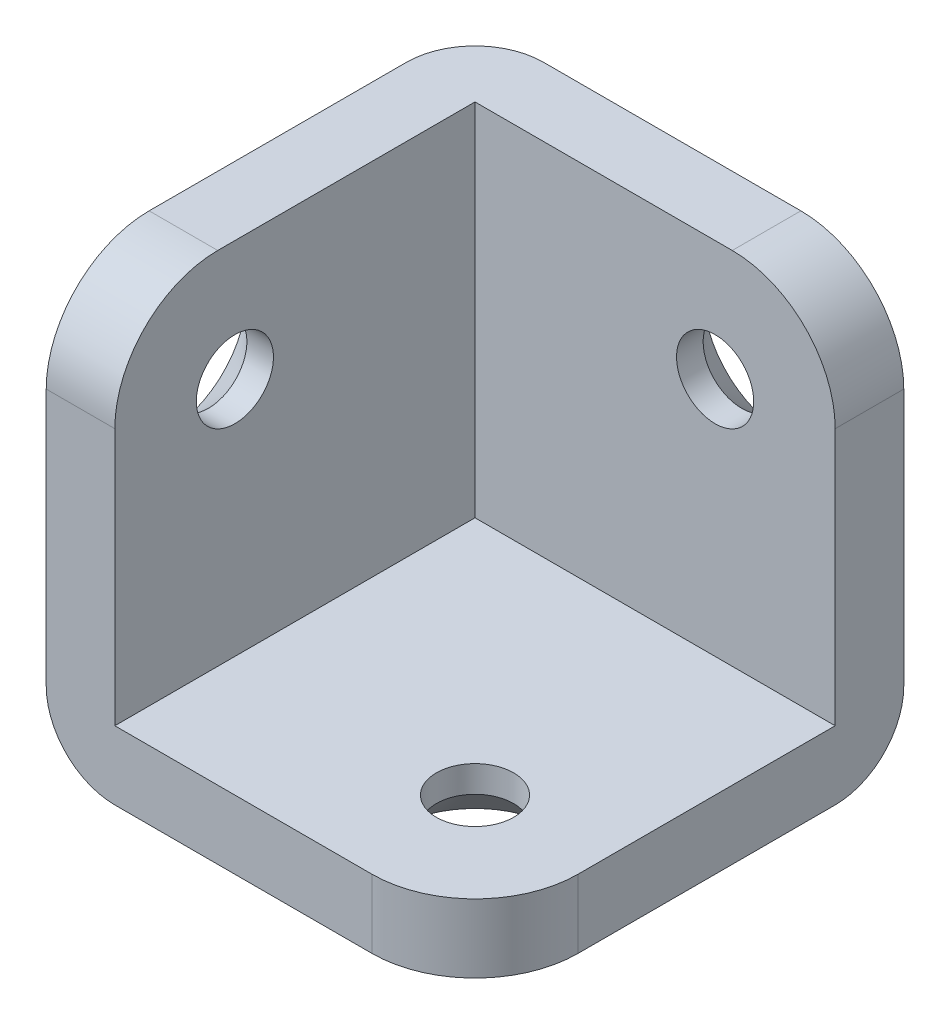
ISO-10303-21;
HEADER;
FILE_DESCRIPTION(('STEP AP214'),'2;1');
FILE_NAME('part.step','',(''),(''),'','','');
FILE_SCHEMA(('AUTOMOTIVE_DESIGN { 1 0 10303 214 1 1 1 1 }'));
ENDSEC;
DATA;
#1=APPLICATION_CONTEXT('core data for automotive mechanical design processes');
#2=APPLICATION_PROTOCOL_DEFINITION('international standard','automotive_design',2000,#1);
#3=PRODUCT_CONTEXT('',#1,'mechanical');
#4=PRODUCT('Part','Part','',(#3));
#5=PRODUCT_RELATED_PRODUCT_CATEGORY('part','',(#4));
#6=PRODUCT_DEFINITION_FORMATION('','',#4);
#7=PRODUCT_DEFINITION_CONTEXT('part definition',#1,'design');
#8=PRODUCT_DEFINITION('design','',#6,#7);
#9=PRODUCT_DEFINITION_SHAPE('','',#8);
#10=(LENGTH_UNIT() NAMED_UNIT(*) SI_UNIT(.MILLI.,.METRE.));
#11=(NAMED_UNIT(*) PLANE_ANGLE_UNIT() SI_UNIT($,.RADIAN.));
#12=(NAMED_UNIT(*) SI_UNIT($,.STERADIAN.) SOLID_ANGLE_UNIT());
#13=UNCERTAINTY_MEASURE_WITH_UNIT(LENGTH_MEASURE(1.E-05),#10,'distance_accuracy_value','');
#14=(GEOMETRIC_REPRESENTATION_CONTEXT(3) GLOBAL_UNCERTAINTY_ASSIGNED_CONTEXT((#13)) GLOBAL_UNIT_ASSIGNED_CONTEXT((#10,
#11,#12)) REPRESENTATION_CONTEXT('',''));
#15=CARTESIAN_POINT('',(0.,0.,0.));
#16=DIRECTION('',(0.,0.,1.));
#17=DIRECTION('',(1.,0.,0.));
#18=AXIS2_PLACEMENT_3D('',#15,#16,#17);
#19=CARTESIAN_POINT('',(0.,25.,0.));
#20=DIRECTION('',(1.,0.,0.));
#21=DIRECTION('',(0.,0.,-1.));
#22=AXIS2_PLACEMENT_3D('',#19,#20,#21);
#23=PLANE('',#22);
#24=DIRECTION('',(0.,-1.,0.));
#25=VECTOR('',#24,1.);
#26=CARTESIAN_POINT('',(0.,25.,4.));
#27=LINE('',#26,#25);
#28=CARTESIAN_POINT('',(0.,25.,4.));
#29=VERTEX_POINT('',#28);
#30=CARTESIAN_POINT('',(0.,4.,4.));
#31=VERTEX_POINT('',#30);
#32=EDGE_CURVE('E205',#29,#31,#27,.T.);
#33=ORIENTED_EDGE('',*,*,#32,.T.);
#34=DIRECTION('',(0.,0.,1.));
#35=VECTOR('',#34,1.);
#36=CARTESIAN_POINT('',(0.,4.,0.));
#37=LINE('',#36,#35);
#38=CARTESIAN_POINT('',(0.,4.,25.));
#39=VERTEX_POINT('',#38);
#40=EDGE_CURVE('E207',#31,#39,#37,.T.);
#41=ORIENTED_EDGE('',*,*,#40,.T.);
#42=DIRECTION('',(0.,-1.,0.));
#43=VECTOR('',#42,1.);
#44=CARTESIAN_POINT('',(0.,25.,25.));
#45=LINE('',#44,#43);
#46=CARTESIAN_POINT('',(0.,19.,25.));
#47=VERTEX_POINT('',#46);
#48=EDGE_CURVE('E177',#47,#39,#45,.T.);
#49=ORIENTED_EDGE('',*,*,#48,.F.);
#50=CARTESIAN_POINT('',(0.,19.,19.));
#51=DIRECTION('',(1.,0.,0.));
#52=DIRECTION('',(0.,0.,-1.));
#53=AXIS2_PLACEMENT_3D('',#50,#51,#52);
#54=CIRCLE('',#53,6.);
#55=CARTESIAN_POINT('',(0.,25.,19.));
#56=VERTEX_POINT('',#55);
#57=EDGE_CURVE('E202',#47,#56,#54,.F.);
#58=ORIENTED_EDGE('',*,*,#57,.T.);
#59=DIRECTION('',(0.,0.,1.));
#60=VECTOR('',#59,1.);
#61=CARTESIAN_POINT('',(0.,25.,0.));
#62=LINE('',#61,#60);
#63=EDGE_CURVE('E168',#29,#56,#62,.T.);
#64=ORIENTED_EDGE('',*,*,#63,.F.);
#65=EDGE_LOOP('',(#33,#41,#49,#58,#64));
#66=FACE_BOUND('',#65,.T.);
#67=CARTESIAN_POINT('',(0.,18.,18.));
#68=DIRECTION('',(-1.,0.,0.));
#69=DIRECTION('',(0.,0.,1.));
#70=AXIS2_PLACEMENT_3D('',#67,#68,#69);
#71=CIRCLE('',#70,4.7);
#72=CARTESIAN_POINT('',(0.,18.,22.7));
#73=VERTEX_POINT('',#72);
#74=EDGE_CURVE('E241',#73,#73,#71,.T.);
#75=ORIENTED_EDGE('',*,*,#74,.F.);
#76=EDGE_LOOP('',(#75));
#77=FACE_BOUND('',#76,.T.);
#78=ADVANCED_FACE('F35',(#66,#77),#23,.F.);
#79=CARTESIAN_POINT('',(0.,0.,0.));
#80=DIRECTION('',(0.,1.,0.));
#81=DIRECTION('',(0.,0.,1.));
#82=AXIS2_PLACEMENT_3D('',#79,#80,#81);
#83=PLANE('',#82);
#84=DIRECTION('',(1.,0.,0.));
#85=VECTOR('',#84,1.);
#86=CARTESIAN_POINT('',(0.,0.,25.));
#87=LINE('',#86,#85);
#88=CARTESIAN_POINT('',(4.00000000000001,0.,25.));
#89=VERTEX_POINT('',#88);
#90=CARTESIAN_POINT('',(19.,0.,25.));
#91=VERTEX_POINT('',#90);
#92=EDGE_CURVE('E166',#89,#91,#87,.T.);
#93=ORIENTED_EDGE('',*,*,#92,.F.);
#94=DIRECTION('',(0.,0.,1.));
#95=VECTOR('',#94,1.);
#96=CARTESIAN_POINT('',(4.,0.,0.));
#97=LINE('',#96,#95);
#98=CARTESIAN_POINT('',(4.,0.,4.));
#99=VERTEX_POINT('',#98);
#100=EDGE_CURVE('E214',#89,#99,#97,.F.);
#101=ORIENTED_EDGE('',*,*,#100,.T.);
#102=DIRECTION('',(-1.,0.,0.));
#103=VECTOR('',#102,1.);
#104=CARTESIAN_POINT('',(0.,0.,4.));
#105=LINE('',#104,#103);
#106=CARTESIAN_POINT('',(25.,0.,4.));
#107=VERTEX_POINT('',#106);
#108=EDGE_CURVE('E212',#99,#107,#105,.F.);
#109=ORIENTED_EDGE('',*,*,#108,.T.);
#110=DIRECTION('',(0.,0.,-1.));
#111=VECTOR('',#110,1.);
#112=CARTESIAN_POINT('',(25.,0.,0.));
#113=LINE('',#112,#111);
#114=CARTESIAN_POINT('',(25.,0.,19.));
#115=VERTEX_POINT('',#114);
#116=EDGE_CURVE('E171',#115,#107,#113,.T.);
#117=ORIENTED_EDGE('',*,*,#116,.F.);
#118=CARTESIAN_POINT('',(19.,0.,19.));
#119=DIRECTION('',(0.,1.,0.));
#120=DIRECTION('',(0.,0.,1.));
#121=AXIS2_PLACEMENT_3D('',#118,#119,#120);
#122=CIRCLE('',#121,6.);
#123=EDGE_CURVE('E185',#115,#91,#122,.F.);
#124=ORIENTED_EDGE('',*,*,#123,.T.);
#125=EDGE_LOOP('',(#93,#101,#109,#117,#124));
#126=FACE_BOUND('',#125,.T.);
#127=CARTESIAN_POINT('',(18.,0.,18.));
#128=DIRECTION('',(0.,-1.,0.));
#129=DIRECTION('',(0.,0.,-1.));
#130=AXIS2_PLACEMENT_3D('',#127,#128,#129);
#131=CIRCLE('',#130,4.7);
#132=CARTESIAN_POINT('',(18.,0.,13.3));
#133=VERTEX_POINT('',#132);
#134=EDGE_CURVE('E250',#133,#133,#131,.T.);
#135=ORIENTED_EDGE('',*,*,#134,.F.);
#136=EDGE_LOOP('',(#135));
#137=FACE_BOUND('',#136,.T.);
#138=ADVANCED_FACE('F273',(#126,#137),#83,.F.);
#139=CARTESIAN_POINT('',(0.,25.,25.));
#140=DIRECTION('',(0.,0.,-1.));
#141=DIRECTION('',(-1.,0.,0.));
#142=AXIS2_PLACEMENT_3D('',#139,#140,#141);
#143=PLANE('',#142);
#144=ORIENTED_EDGE('',*,*,#48,.T.);
#145=CARTESIAN_POINT('',(4.00000000000001,4.,25.));
#146=DIRECTION('',(0.,0.,-1.));
#147=DIRECTION('',(-1.,0.,0.));
#148=AXIS2_PLACEMENT_3D('',#145,#146,#147);
#149=CIRCLE('',#148,4.);
#150=EDGE_CURVE('E210',#39,#89,#149,.F.);
#151=ORIENTED_EDGE('',*,*,#150,.T.);
#152=ORIENTED_EDGE('',*,*,#92,.T.);
#153=DIRECTION('',(0.,-1.,0.));
#154=VECTOR('',#153,1.);
#155=CARTESIAN_POINT('',(19.,25.,25.));
#156=LINE('',#155,#154);
#157=CARTESIAN_POINT('',(19.,4.,25.));
#158=VERTEX_POINT('',#157);
#159=EDGE_CURVE('E190',#91,#158,#156,.F.);
#160=ORIENTED_EDGE('',*,*,#159,.T.);
#161=DIRECTION('',(-1.,0.,0.));
#162=VECTOR('',#161,1.);
#163=CARTESIAN_POINT('',(25.,4.,25.));
#164=LINE('',#163,#162);
#165=CARTESIAN_POINT('',(4.,4.,25.));
#166=VERTEX_POINT('',#165);
#167=EDGE_CURVE('E259',#158,#166,#164,.T.);
#168=ORIENTED_EDGE('',*,*,#167,.T.);
#169=DIRECTION('',(0.,1.,0.));
#170=VECTOR('',#169,1.);
#171=CARTESIAN_POINT('',(4.,-29.698484809835,25.));
#172=LINE('',#171,#170);
#173=CARTESIAN_POINT('',(4.,19.,25.));
#174=VERTEX_POINT('',#173);
#175=EDGE_CURVE('E150',#166,#174,#172,.T.);
#176=ORIENTED_EDGE('',*,*,#175,.T.);
#177=DIRECTION('',(1.,0.,0.));
#178=VECTOR('',#177,1.);
#179=CARTESIAN_POINT('',(0.,19.,25.));
#180=LINE('',#179,#178);
#181=EDGE_CURVE('E188',#174,#47,#180,.F.);
#182=ORIENTED_EDGE('',*,*,#181,.T.);
#183=EDGE_LOOP('',(#144,#151,#152,#160,#168,#176,#182));
#184=FACE_BOUND('',#183,.T.);
#185=ADVANCED_FACE('F296',(#184),#143,.F.);
#186=CARTESIAN_POINT('',(25.,25.,0.));
#187=DIRECTION('',(-1.,0.,0.));
#188=DIRECTION('',(0.,0.,1.));
#189=AXIS2_PLACEMENT_3D('',#186,#187,#188);
#190=PLANE('',#189);
#191=ORIENTED_EDGE('',*,*,#116,.T.);
#192=CARTESIAN_POINT('',(25.,4.,4.));
#193=DIRECTION('',(-1.,0.,0.));
#194=DIRECTION('',(0.,0.,1.));
#195=AXIS2_PLACEMENT_3D('',#192,#193,#194);
#196=CIRCLE('',#195,4.);
#197=CARTESIAN_POINT('',(25.,4.,0.));
#198=VERTEX_POINT('',#197);
#199=EDGE_CURVE('E12',#107,#198,#196,.F.);
#200=ORIENTED_EDGE('',*,*,#199,.T.);
#201=DIRECTION('',(0.,-1.,0.));
#202=VECTOR('',#201,1.);
#203=CARTESIAN_POINT('',(25.,25.,0.));
#204=LINE('',#203,#202);
#205=CARTESIAN_POINT('',(25.,19.,0.));
#206=VERTEX_POINT('',#205);
#207=EDGE_CURVE('E173',#206,#198,#204,.T.);
#208=ORIENTED_EDGE('',*,*,#207,.F.);
#209=DIRECTION('',(0.,0.,-1.));
#210=VECTOR('',#209,1.);
#211=CARTESIAN_POINT('',(25.,19.,4.));
#212=LINE('',#211,#210);
#213=CARTESIAN_POINT('',(25.,19.,4.));
#214=VERTEX_POINT('',#213);
#215=EDGE_CURVE('E180',#206,#214,#212,.F.);
#216=ORIENTED_EDGE('',*,*,#215,.T.);
#217=DIRECTION('',(0.,1.,0.));
#218=VECTOR('',#217,1.);
#219=CARTESIAN_POINT('',(25.,-29.698484809835,4.));
#220=LINE('',#219,#218);
#221=CARTESIAN_POINT('',(25.,4.,4.));
#222=VERTEX_POINT('',#221);
#223=EDGE_CURVE('E151',#222,#214,#220,.T.);
#224=ORIENTED_EDGE('',*,*,#223,.F.);
#225=DIRECTION('',(0.,0.,1.));
#226=VECTOR('',#225,1.);
#227=CARTESIAN_POINT('',(25.,4.,25.));
#228=LINE('',#227,#226);
#229=CARTESIAN_POINT('',(25.,4.,19.));
#230=VERTEX_POINT('',#229);
#231=EDGE_CURVE('E167',#222,#230,#228,.T.);
#232=ORIENTED_EDGE('',*,*,#231,.T.);
#233=DIRECTION('',(0.,-1.,0.));
#234=VECTOR('',#233,1.);
#235=CARTESIAN_POINT('',(25.,25.,19.));
#236=LINE('',#235,#234);
#237=EDGE_CURVE('E182',#230,#115,#236,.T.);
#238=ORIENTED_EDGE('',*,*,#237,.T.);
#239=EDGE_LOOP('',(#191,#200,#208,#216,#224,#232,#238));
#240=FACE_BOUND('',#239,.T.);
#241=ADVANCED_FACE('F264',(#240),#190,.F.);
#242=CARTESIAN_POINT('',(0.,25.,0.));
#243=DIRECTION('',(0.,0.,1.));
#244=DIRECTION('',(1.,0.,0.));
#245=AXIS2_PLACEMENT_3D('',#242,#243,#244);
#246=PLANE('',#245);
#247=CARTESIAN_POINT('',(18.,18.,0.));
#248=DIRECTION('',(0.,0.,-1.));
#249=DIRECTION('',(-1.,0.,0.));
#250=AXIS2_PLACEMENT_3D('',#247,#248,#249);
#251=CIRCLE('',#250,4.7);
#252=CARTESIAN_POINT('',(13.3,18.,0.));
#253=VERTEX_POINT('',#252);
#254=EDGE_CURVE('E228',#253,#253,#251,.T.);
#255=ORIENTED_EDGE('',*,*,#254,.F.);
#256=EDGE_LOOP('',(#255));
#257=FACE_BOUND('',#256,.T.);
#258=DIRECTION('',(-1.,0.,0.));
#259=VECTOR('',#258,1.);
#260=CARTESIAN_POINT('',(0.,4.,0.));
#261=LINE('',#260,#259);
#262=CARTESIAN_POINT('',(4.,4.,0.));
#263=VERTEX_POINT('',#262);
#264=EDGE_CURVE('E52',#198,#263,#261,.T.);
#265=ORIENTED_EDGE('',*,*,#264,.T.);
#266=DIRECTION('',(0.,-1.,0.));
#267=VECTOR('',#266,1.);
#268=CARTESIAN_POINT('',(4.,25.,0.));
#269=LINE('',#268,#267);
#270=CARTESIAN_POINT('',(4.,25.,0.));
#271=VERTEX_POINT('',#270);
#272=EDGE_CURVE('E217',#263,#271,#269,.F.);
#273=ORIENTED_EDGE('',*,*,#272,.T.);
#274=DIRECTION('',(-1.,0.,0.));
#275=VECTOR('',#274,1.);
#276=CARTESIAN_POINT('',(0.,25.,0.));
#277=LINE('',#276,#275);
#278=CARTESIAN_POINT('',(19.,25.,0.));
#279=VERTEX_POINT('',#278);
#280=EDGE_CURVE('E170',#279,#271,#277,.T.);
#281=ORIENTED_EDGE('',*,*,#280,.F.);
#282=CARTESIAN_POINT('',(19.,19.,0.));
#283=DIRECTION('',(0.,0.,1.));
#284=DIRECTION('',(1.,0.,0.));
#285=AXIS2_PLACEMENT_3D('',#282,#283,#284);
#286=CIRCLE('',#285,6.);
#287=EDGE_CURVE('E197',#279,#206,#286,.F.);
#288=ORIENTED_EDGE('',*,*,#287,.T.);
#289=ORIENTED_EDGE('',*,*,#207,.T.);
#290=EDGE_LOOP('',(#265,#273,#281,#288,#289));
#291=FACE_BOUND('',#290,.T.);
#292=ADVANCED_FACE('F444',(#257,#291),#246,.F.);
#293=CARTESIAN_POINT('',(0.,25.,0.));
#294=DIRECTION('',(0.,1.,0.));
#295=DIRECTION('',(0.,0.,1.));
#296=AXIS2_PLACEMENT_3D('',#293,#294,#295);
#297=PLANE('',#296);
#298=ORIENTED_EDGE('',*,*,#280,.T.);
#299=CARTESIAN_POINT('',(4.,25.,4.));
#300=DIRECTION('',(0.,1.,0.));
#301=DIRECTION('',(0.,0.,1.));
#302=AXIS2_PLACEMENT_3D('',#299,#300,#301);
#303=CIRCLE('',#302,4.);
#304=EDGE_CURVE('E44',#271,#29,#303,.T.);
#305=ORIENTED_EDGE('',*,*,#304,.T.);
#306=ORIENTED_EDGE('',*,*,#63,.T.);
#307=DIRECTION('',(1.,0.,0.));
#308=VECTOR('',#307,1.);
#309=CARTESIAN_POINT('',(4.,25.,19.));
#310=LINE('',#309,#308);
#311=CARTESIAN_POINT('',(4.,25.,19.));
#312=VERTEX_POINT('',#311);
#313=EDGE_CURVE('E157',#56,#312,#310,.T.);
#314=ORIENTED_EDGE('',*,*,#313,.T.);
#315=DIRECTION('',(0.,0.,1.));
#316=VECTOR('',#315,1.);
#317=CARTESIAN_POINT('',(4.,25.,25.));
#318=LINE('',#317,#316);
#319=CARTESIAN_POINT('',(4.,25.,4.));
#320=VERTEX_POINT('',#319);
#321=EDGE_CURVE('E141',#320,#312,#318,.T.);
#322=ORIENTED_EDGE('',*,*,#321,.F.);
#323=DIRECTION('',(-1.,0.,0.));
#324=VECTOR('',#323,1.);
#325=CARTESIAN_POINT('',(25.,25.,4.));
#326=LINE('',#325,#324);
#327=CARTESIAN_POINT('',(19.,25.,4.));
#328=VERTEX_POINT('',#327);
#329=EDGE_CURVE('E129',#328,#320,#326,.T.);
#330=ORIENTED_EDGE('',*,*,#329,.F.);
#331=DIRECTION('',(0.,0.,-1.));
#332=VECTOR('',#331,1.);
#333=CARTESIAN_POINT('',(19.,25.,0.));
#334=LINE('',#333,#332);
#335=EDGE_CURVE('E195',#328,#279,#334,.T.);
#336=ORIENTED_EDGE('',*,*,#335,.T.);
#337=EDGE_LOOP('',(#298,#305,#306,#314,#322,#330,#336));
#338=FACE_BOUND('',#337,.T.);
#339=ADVANCED_FACE('F155',(#338),#297,.T.);
#340=CARTESIAN_POINT('',(4.,-29.698484809835,25.));
#341=DIRECTION('',(-1.,0.,0.));
#342=DIRECTION('',(0.,0.,1.));
#343=AXIS2_PLACEMENT_3D('',#340,#341,#342);
#344=PLANE('',#343);
#345=CARTESIAN_POINT('',(4.,18.,18.));
#346=DIRECTION('',(-1.,0.,0.));
#347=DIRECTION('',(0.,0.,1.));
#348=AXIS2_PLACEMENT_3D('',#345,#346,#347);
#349=CIRCLE('',#348,2.24999999999999);
#350=CARTESIAN_POINT('',(4.,18.,20.25));
#351=VERTEX_POINT('',#350);
#352=EDGE_CURVE('E247',#351,#351,#349,.T.);
#353=ORIENTED_EDGE('',*,*,#352,.T.);
#354=EDGE_LOOP('',(#353));
#355=FACE_BOUND('',#354,.T.);
#356=ORIENTED_EDGE('',*,*,#321,.T.);
#357=CARTESIAN_POINT('',(4.,19.,19.));
#358=DIRECTION('',(-1.,0.,0.));
#359=DIRECTION('',(0.,0.,1.));
#360=AXIS2_PLACEMENT_3D('',#357,#358,#359);
#361=CIRCLE('',#360,6.);
#362=EDGE_CURVE('E200',#312,#174,#361,.F.);
#363=ORIENTED_EDGE('',*,*,#362,.T.);
#364=ORIENTED_EDGE('',*,*,#175,.F.);
#365=DIRECTION('',(0.,0.,-1.));
#366=VECTOR('',#365,1.);
#367=CARTESIAN_POINT('',(4.,4.,25.));
#368=LINE('',#367,#366);
#369=CARTESIAN_POINT('',(4.,4.,4.));
#370=VERTEX_POINT('',#369);
#371=EDGE_CURVE('E149',#166,#370,#368,.T.);
#372=ORIENTED_EDGE('',*,*,#371,.T.);
#373=DIRECTION('',(0.,1.,0.));
#374=VECTOR('',#373,1.);
#375=CARTESIAN_POINT('',(4.,-29.698484809835,4.));
#376=LINE('',#375,#374);
#377=EDGE_CURVE('E133',#370,#320,#376,.T.);
#378=ORIENTED_EDGE('',*,*,#377,.T.);
#379=EDGE_LOOP('',(#356,#363,#364,#372,#378));
#380=FACE_BOUND('',#379,.T.);
#381=ADVANCED_FACE('F146',(#355,#380),#344,.F.);
#382=CARTESIAN_POINT('',(25.,-29.698484809835,4.));
#383=DIRECTION('',(0.,0.,-1.));
#384=DIRECTION('',(-1.,0.,0.));
#385=AXIS2_PLACEMENT_3D('',#382,#383,#384);
#386=PLANE('',#385);
#387=CARTESIAN_POINT('',(18.,18.,4.));
#388=DIRECTION('',(0.,0.,-1.));
#389=DIRECTION('',(-1.,0.,0.));
#390=AXIS2_PLACEMENT_3D('',#387,#388,#389);
#391=CIRCLE('',#390,2.24999999999999);
#392=CARTESIAN_POINT('',(15.75,18.,4.));
#393=VERTEX_POINT('',#392);
#394=EDGE_CURVE('E236',#393,#393,#391,.T.);
#395=ORIENTED_EDGE('',*,*,#394,.T.);
#396=EDGE_LOOP('',(#395));
#397=FACE_BOUND('',#396,.T.);
#398=ORIENTED_EDGE('',*,*,#223,.T.);
#399=CARTESIAN_POINT('',(19.,19.,4.));
#400=DIRECTION('',(0.,0.,-1.));
#401=DIRECTION('',(-1.,0.,0.));
#402=AXIS2_PLACEMENT_3D('',#399,#400,#401);
#403=CIRCLE('',#402,6.);
#404=EDGE_CURVE('E136',#214,#328,#403,.F.);
#405=ORIENTED_EDGE('',*,*,#404,.T.);
#406=ORIENTED_EDGE('',*,*,#329,.T.);
#407=ORIENTED_EDGE('',*,*,#377,.F.);
#408=DIRECTION('',(1.,0.,0.));
#409=VECTOR('',#408,1.);
#410=CARTESIAN_POINT('',(25.,4.,4.));
#411=LINE('',#410,#409);
#412=EDGE_CURVE('E164',#370,#222,#411,.T.);
#413=ORIENTED_EDGE('',*,*,#412,.T.);
#414=EDGE_LOOP('',(#398,#405,#406,#407,#413));
#415=FACE_BOUND('',#414,.T.);
#416=ADVANCED_FACE('F132',(#397,#415),#386,.F.);
#417=CARTESIAN_POINT('',(0.,4.,0.));
#418=DIRECTION('',(0.,1.,0.));
#419=DIRECTION('',(0.,0.,1.));
#420=AXIS2_PLACEMENT_3D('',#417,#418,#419);
#421=PLANE('',#420);
#422=CARTESIAN_POINT('',(18.,4.,18.));
#423=DIRECTION('',(0.,1.,0.));
#424=DIRECTION('',(0.,0.,1.));
#425=AXIS2_PLACEMENT_3D('',#422,#423,#424);
#426=CIRCLE('',#425,2.24999999999999);
#427=CARTESIAN_POINT('',(18.,4.,20.25));
#428=VERTEX_POINT('',#427);
#429=EDGE_CURVE('E142',#428,#428,#426,.T.);
#430=ORIENTED_EDGE('',*,*,#429,.F.);
#431=EDGE_LOOP('',(#430));
#432=FACE_BOUND('',#431,.T.);
#433=ORIENTED_EDGE('',*,*,#167,.F.);
#434=CARTESIAN_POINT('',(19.,4.,19.));
#435=DIRECTION('',(0.,1.,0.));
#436=DIRECTION('',(0.,0.,1.));
#437=AXIS2_PLACEMENT_3D('',#434,#435,#436);
#438=CIRCLE('',#437,6.);
#439=EDGE_CURVE('E192',#158,#230,#438,.T.);
#440=ORIENTED_EDGE('',*,*,#439,.T.);
#441=ORIENTED_EDGE('',*,*,#231,.F.);
#442=ORIENTED_EDGE('',*,*,#412,.F.);
#443=ORIENTED_EDGE('',*,*,#371,.F.);
#444=EDGE_LOOP('',(#433,#440,#441,#442,#443));
#445=FACE_BOUND('',#444,.T.);
#446=ADVANCED_FACE('F305',(#432,#445),#421,.T.);
#447=CARTESIAN_POINT('',(19.,25.,19.));
#448=DIRECTION('',(0.,-1.,0.));
#449=DIRECTION('',(0.,0.,-1.));
#450=AXIS2_PLACEMENT_3D('',#447,#448,#449);
#451=CYLINDRICAL_SURFACE('',#450,6.);
#452=ORIENTED_EDGE('',*,*,#439,.F.);
#453=ORIENTED_EDGE('',*,*,#159,.F.);
#454=ORIENTED_EDGE('',*,*,#123,.F.);
#455=ORIENTED_EDGE('',*,*,#237,.F.);
#456=EDGE_LOOP('',(#452,#453,#454,#455));
#457=FACE_BOUND('',#456,.T.);
#458=ADVANCED_FACE('F269',(#457),#451,.T.);
#459=CARTESIAN_POINT('',(19.,19.,0.));
#460=DIRECTION('',(0.,0.,1.));
#461=DIRECTION('',(1.,0.,0.));
#462=AXIS2_PLACEMENT_3D('',#459,#460,#461);
#463=CYLINDRICAL_SURFACE('',#462,6.);
#464=ORIENTED_EDGE('',*,*,#404,.F.);
#465=ORIENTED_EDGE('',*,*,#215,.F.);
#466=ORIENTED_EDGE('',*,*,#287,.F.);
#467=ORIENTED_EDGE('',*,*,#335,.F.);
#468=EDGE_LOOP('',(#464,#465,#466,#467));
#469=FACE_BOUND('',#468,.T.);
#470=ADVANCED_FACE('F304',(#469),#463,.T.);
#471=CARTESIAN_POINT('',(0.,19.,19.));
#472=DIRECTION('',(-1.,0.,0.));
#473=DIRECTION('',(0.,0.,1.));
#474=AXIS2_PLACEMENT_3D('',#471,#472,#473);
#475=CYLINDRICAL_SURFACE('',#474,6.);
#476=ORIENTED_EDGE('',*,*,#57,.F.);
#477=ORIENTED_EDGE('',*,*,#181,.F.);
#478=ORIENTED_EDGE('',*,*,#362,.F.);
#479=ORIENTED_EDGE('',*,*,#313,.F.);
#480=EDGE_LOOP('',(#476,#477,#478,#479));
#481=FACE_BOUND('',#480,.T.);
#482=ADVANCED_FACE('F308',(#481),#475,.T.);
#483=CARTESIAN_POINT('',(18.,0.,18.));
#484=DIRECTION('',(0.,-1.,0.));
#485=DIRECTION('',(0.,0.,-1.));
#486=AXIS2_PLACEMENT_3D('',#483,#484,#485);
#487=CYLINDRICAL_SURFACE('',#486,2.24999999999999);
#488=CARTESIAN_POINT('',(18.,2.45000000000001,18.));
#489=DIRECTION('',(0.,-1.,0.));
#490=DIRECTION('',(0.,0.,-1.));
#491=AXIS2_PLACEMENT_3D('',#488,#489,#490);
#492=CIRCLE('',#491,2.24999999999999);
#493=CARTESIAN_POINT('',(18.,2.45000000000001,15.75));
#494=VERTEX_POINT('',#493);
#495=EDGE_CURVE('E253',#494,#494,#492,.T.);
#496=ORIENTED_EDGE('',*,*,#495,.T.);
#497=EDGE_LOOP('',(#496));
#498=FACE_BOUND('',#497,.T.);
#499=ORIENTED_EDGE('',*,*,#429,.T.);
#500=EDGE_LOOP('',(#499));
#501=FACE_BOUND('',#500,.T.);
#502=ADVANCED_FACE('F312',(#498,#501),#487,.F.);
#503=CARTESIAN_POINT('',(18.,0.,18.));
#504=DIRECTION('',(0.,-1.,0.));
#505=DIRECTION('',(0.,0.,-1.));
#506=AXIS2_PLACEMENT_3D('',#503,#504,#505);
#507=CONICAL_SURFACE('',#506,4.7,0.785398163397449);
#508=ORIENTED_EDGE('',*,*,#495,.F.);
#509=EDGE_LOOP('',(#508));
#510=FACE_BOUND('',#509,.T.);
#511=ORIENTED_EDGE('',*,*,#134,.T.);
#512=EDGE_LOOP('',(#511));
#513=FACE_BOUND('',#512,.T.);
#514=ADVANCED_FACE('F371',(#510,#513),#507,.F.);
#515=CARTESIAN_POINT('',(0.,18.,18.));
#516=DIRECTION('',(-1.,0.,0.));
#517=DIRECTION('',(0.,0.,1.));
#518=AXIS2_PLACEMENT_3D('',#515,#516,#517);
#519=CYLINDRICAL_SURFACE('',#518,2.24999999999999);
#520=ORIENTED_EDGE('',*,*,#352,.F.);
#521=EDGE_LOOP('',(#520));
#522=FACE_BOUND('',#521,.T.);
#523=CARTESIAN_POINT('',(2.45000000000001,18.,18.));
#524=DIRECTION('',(-1.,0.,0.));
#525=DIRECTION('',(0.,0.,1.));
#526=AXIS2_PLACEMENT_3D('',#523,#524,#525);
#527=CIRCLE('',#526,2.24999999999999);
#528=CARTESIAN_POINT('',(2.45000000000001,18.,20.25));
#529=VERTEX_POINT('',#528);
#530=EDGE_CURVE('E244',#529,#529,#527,.T.);
#531=ORIENTED_EDGE('',*,*,#530,.T.);
#532=EDGE_LOOP('',(#531));
#533=FACE_BOUND('',#532,.T.);
#534=ADVANCED_FACE('F362',(#522,#533),#519,.F.);
#535=CARTESIAN_POINT('',(0.,18.,18.));
#536=DIRECTION('',(-1.,0.,0.));
#537=DIRECTION('',(0.,0.,1.));
#538=AXIS2_PLACEMENT_3D('',#535,#536,#537);
#539=CONICAL_SURFACE('',#538,4.7,0.785398163397449);
#540=ORIENTED_EDGE('',*,*,#530,.F.);
#541=EDGE_LOOP('',(#540));
#542=FACE_BOUND('',#541,.T.);
#543=ORIENTED_EDGE('',*,*,#74,.T.);
#544=EDGE_LOOP('',(#543));
#545=FACE_BOUND('',#544,.T.);
#546=ADVANCED_FACE('F353',(#542,#545),#539,.F.);
#547=CARTESIAN_POINT('',(18.,18.,0.));
#548=DIRECTION('',(0.,0.,-1.));
#549=DIRECTION('',(-1.,0.,0.));
#550=AXIS2_PLACEMENT_3D('',#547,#548,#549);
#551=CYLINDRICAL_SURFACE('',#550,2.24999999999999);
#552=ORIENTED_EDGE('',*,*,#394,.F.);
#553=EDGE_LOOP('',(#552));
#554=FACE_BOUND('',#553,.T.);
#555=CARTESIAN_POINT('',(18.,18.,2.45000000000001));
#556=DIRECTION('',(0.,0.,-1.));
#557=DIRECTION('',(-1.,0.,0.));
#558=AXIS2_PLACEMENT_3D('',#555,#556,#557);
#559=CIRCLE('',#558,2.24999999999999);
#560=CARTESIAN_POINT('',(15.75,18.,2.45000000000001));
#561=VERTEX_POINT('',#560);
#562=EDGE_CURVE('E231',#561,#561,#559,.T.);
#563=ORIENTED_EDGE('',*,*,#562,.T.);
#564=EDGE_LOOP('',(#563));
#565=FACE_BOUND('',#564,.T.);
#566=ADVANCED_FACE('F287',(#554,#565),#551,.F.);
#567=CARTESIAN_POINT('',(18.,18.,0.));
#568=DIRECTION('',(0.,0.,-1.));
#569=DIRECTION('',(-1.,0.,0.));
#570=AXIS2_PLACEMENT_3D('',#567,#568,#569);
#571=CONICAL_SURFACE('',#570,4.7,0.785398163397449);
#572=ORIENTED_EDGE('',*,*,#562,.F.);
#573=EDGE_LOOP('',(#572));
#574=FACE_BOUND('',#573,.T.);
#575=ORIENTED_EDGE('',*,*,#254,.T.);
#576=EDGE_LOOP('',(#575));
#577=FACE_BOUND('',#576,.T.);
#578=ADVANCED_FACE('F280',(#574,#577),#571,.F.);
#579=CARTESIAN_POINT('',(0.,4.,4.));
#580=DIRECTION('',(-1.,0.,0.));
#581=DIRECTION('',(0.,0.,1.));
#582=AXIS2_PLACEMENT_3D('',#579,#580,#581);
#583=CYLINDRICAL_SURFACE('',#582,4.);
#584=ORIENTED_EDGE('',*,*,#199,.F.);
#585=ORIENTED_EDGE('',*,*,#108,.F.);
#586=CARTESIAN_POINT('',(4.,4.,4.));
#587=DIRECTION('',(-1.,0.,0.));
#588=DIRECTION('',(0.,0.,1.));
#589=AXIS2_PLACEMENT_3D('',#586,#587,#588);
#590=CIRCLE('',#589,4.);
#591=EDGE_CURVE('E39',#263,#99,#590,.T.);
#592=ORIENTED_EDGE('',*,*,#591,.F.);
#593=ORIENTED_EDGE('',*,*,#264,.F.);
#594=EDGE_LOOP('',(#584,#585,#592,#593));
#595=FACE_BOUND('',#594,.T.);
#596=ADVANCED_FACE('F37',(#595),#583,.T.);
#597=CARTESIAN_POINT('',(4.,25.,4.));
#598=DIRECTION('',(0.,-1.,0.));
#599=DIRECTION('',(0.,0.,-1.));
#600=AXIS2_PLACEMENT_3D('',#597,#598,#599);
#601=CYLINDRICAL_SURFACE('',#600,4.);
#602=ORIENTED_EDGE('',*,*,#304,.F.);
#603=ORIENTED_EDGE('',*,*,#272,.F.);
#604=CARTESIAN_POINT('',(4.,4.,4.));
#605=DIRECTION('',(0.,-1.,0.));
#606=DIRECTION('',(0.,0.,-1.));
#607=AXIS2_PLACEMENT_3D('',#604,#605,#606);
#608=CIRCLE('',#607,4.);
#609=EDGE_CURVE('E222',#31,#263,#608,.T.);
#610=ORIENTED_EDGE('',*,*,#609,.F.);
#611=ORIENTED_EDGE('',*,*,#32,.F.);
#612=EDGE_LOOP('',(#602,#603,#610,#611));
#613=FACE_BOUND('',#612,.T.);
#614=ADVANCED_FACE('F279',(#613),#601,.T.);
#615=CARTESIAN_POINT('',(4.,4.,4.));
#616=DIRECTION('',(0.,0.,1.));
#617=DIRECTION('',(1.,0.,0.));
#618=AXIS2_PLACEMENT_3D('',#615,#616,#617);
#619=SPHERICAL_SURFACE('',#618,4.);
#620=ORIENTED_EDGE('',*,*,#609,.T.);
#621=ORIENTED_EDGE('',*,*,#591,.T.);
#622=CARTESIAN_POINT('',(4.,4.,4.));
#623=DIRECTION('',(0.,0.,-1.));
#624=DIRECTION('',(-1.,0.,0.));
#625=AXIS2_PLACEMENT_3D('',#622,#623,#624);
#626=CIRCLE('',#625,4.);
#627=EDGE_CURVE('E220',#31,#99,#626,.F.);
#628=ORIENTED_EDGE('',*,*,#627,.F.);
#629=EDGE_LOOP('',(#620,#621,#628));
#630=FACE_BOUND('',#629,.T.);
#631=ADVANCED_FACE('F285',(#630),#619,.T.);
#632=CARTESIAN_POINT('',(4.,4.,0.));
#633=DIRECTION('',(0.,0.,1.));
#634=DIRECTION('',(1.,0.,0.));
#635=AXIS2_PLACEMENT_3D('',#632,#633,#634);
#636=CYLINDRICAL_SURFACE('',#635,4.);
#637=ORIENTED_EDGE('',*,*,#627,.T.);
#638=ORIENTED_EDGE('',*,*,#100,.F.);
#639=ORIENTED_EDGE('',*,*,#150,.F.);
#640=ORIENTED_EDGE('',*,*,#40,.F.);
#641=EDGE_LOOP('',(#637,#638,#639,#640));
#642=FACE_BOUND('',#641,.T.);
#643=ADVANCED_FACE('F314',(#642),#636,.T.);
#644=CLOSED_SHELL('',(#78,#138,#185,#241,#292,#339,#381,#416,#446,#458,#470,#482,#502,#514,#534,
#546,#566,#578,#596,#614,#631,#643));
#645=MANIFOLD_SOLID_BREP('B2',#644);
#646=ADVANCED_BREP_SHAPE_REPRESENTATION('',(#18,#645),#14);
#647=SHAPE_DEFINITION_REPRESENTATION(#9,#646);
ENDSEC;
END-ISO-10303-21;
